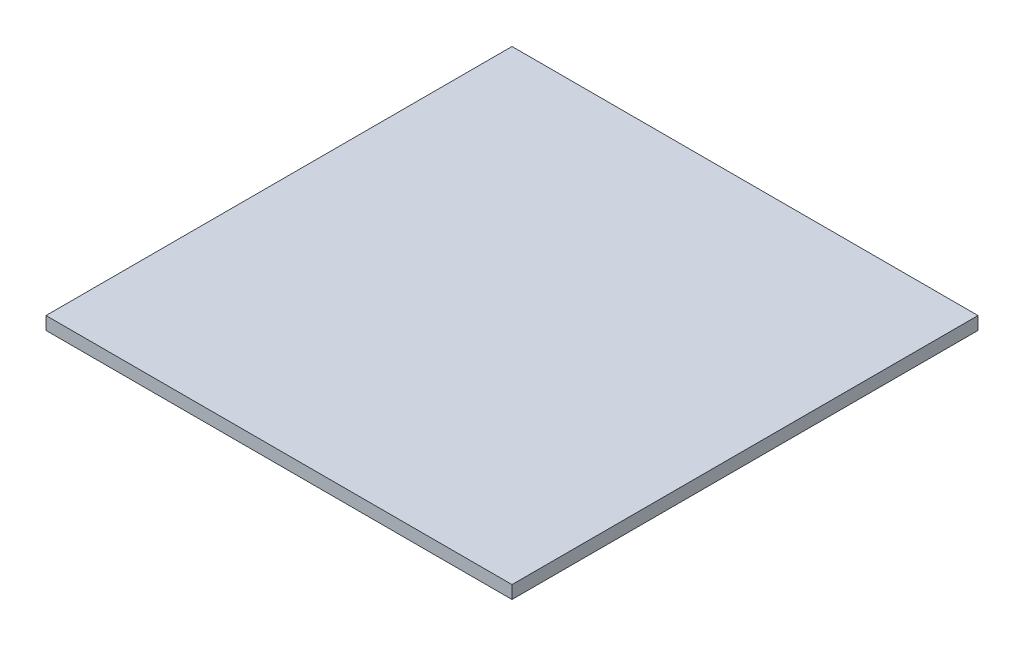
ISO-10303-21;
HEADER;
FILE_DESCRIPTION(('STEP AP214'),'2;1');
FILE_NAME('part.step','',(''),(''),'','','');
FILE_SCHEMA(('AUTOMOTIVE_DESIGN { 1 0 10303 214 1 1 1 1 }'));
ENDSEC;
DATA;
#1=APPLICATION_CONTEXT('core data for automotive mechanical design processes');
#2=APPLICATION_PROTOCOL_DEFINITION('international standard','automotive_design',2000,#1);
#3=PRODUCT_CONTEXT('',#1,'mechanical');
#4=PRODUCT('Part','Part','',(#3));
#5=PRODUCT_RELATED_PRODUCT_CATEGORY('part','',(#4));
#6=PRODUCT_DEFINITION_FORMATION('','',#4);
#7=PRODUCT_DEFINITION_CONTEXT('part definition',#1,'design');
#8=PRODUCT_DEFINITION('design','',#6,#7);
#9=PRODUCT_DEFINITION_SHAPE('','',#8);
#10=(LENGTH_UNIT() NAMED_UNIT(*) SI_UNIT(.MILLI.,.METRE.));
#11=(NAMED_UNIT(*) PLANE_ANGLE_UNIT() SI_UNIT($,.RADIAN.));
#12=(NAMED_UNIT(*) SI_UNIT($,.STERADIAN.) SOLID_ANGLE_UNIT());
#13=UNCERTAINTY_MEASURE_WITH_UNIT(LENGTH_MEASURE(1.E-05),#10,'distance_accuracy_value','');
#14=(GEOMETRIC_REPRESENTATION_CONTEXT(3) GLOBAL_UNCERTAINTY_ASSIGNED_CONTEXT((#13)) GLOBAL_UNIT_ASSIGNED_CONTEXT((#10,
#11,#12)) REPRESENTATION_CONTEXT('',''));
#15=CARTESIAN_POINT('',(0.,0.,0.));
#16=DIRECTION('',(0.,0.,1.));
#17=DIRECTION('',(1.,0.,0.));
#18=AXIS2_PLACEMENT_3D('',#15,#16,#17);
#19=CARTESIAN_POINT('',(-457.200000000001,-12.7000000000001,457.2));
#20=DIRECTION('',(1.,0.,0.));
#21=DIRECTION('',(0.,0.,-1.));
#22=AXIS2_PLACEMENT_3D('',#19,#20,#21);
#23=PLANE('',#22);
#24=DIRECTION('',(0.,-1.,0.));
#25=VECTOR('',#24,1.);
#26=CARTESIAN_POINT('',(-457.200000000001,-12.7000000000001,-457.2));
#27=LINE('',#26,#25);
#28=CARTESIAN_POINT('',(-457.200000000001,12.6999999999999,-457.2));
#29=VERTEX_POINT('',#28);
#30=CARTESIAN_POINT('',(-457.200000000001,-12.7000000000001,-457.2));
#31=VERTEX_POINT('',#30);
#32=EDGE_CURVE('E107',#29,#31,#27,.T.);
#33=ORIENTED_EDGE('',*,*,#32,.T.);
#34=DIRECTION('',(0.,0.,-1.));
#35=VECTOR('',#34,1.);
#36=CARTESIAN_POINT('',(-457.200000000001,-12.7000000000001,457.2));
#37=LINE('',#36,#35);
#38=CARTESIAN_POINT('',(-457.200000000001,-12.7000000000001,457.2));
#39=VERTEX_POINT('',#38);
#40=EDGE_CURVE('E11',#39,#31,#37,.T.);
#41=ORIENTED_EDGE('',*,*,#40,.F.);
#42=DIRECTION('',(0.,-1.,0.));
#43=VECTOR('',#42,1.);
#44=CARTESIAN_POINT('',(-457.200000000001,-12.7000000000001,457.2));
#45=LINE('',#44,#43);
#46=CARTESIAN_POINT('',(-457.200000000001,12.6999999999999,457.2));
#47=VERTEX_POINT('',#46);
#48=EDGE_CURVE('E91',#47,#39,#45,.T.);
#49=ORIENTED_EDGE('',*,*,#48,.F.);
#50=DIRECTION('',(0.,0.,-1.));
#51=VECTOR('',#50,1.);
#52=CARTESIAN_POINT('',(-457.200000000001,12.6999999999999,457.2));
#53=LINE('',#52,#51);
#54=EDGE_CURVE('E103',#47,#29,#53,.T.);
#55=ORIENTED_EDGE('',*,*,#54,.T.);
#56=EDGE_LOOP('',(#33,#41,#49,#55));
#57=FACE_BOUND('',#56,.T.);
#58=ADVANCED_FACE('F39',(#57),#23,.F.);
#59=CARTESIAN_POINT('',(457.199999999999,-12.6999999999999,457.2));
#60=DIRECTION('',(0.,1.,0.));
#61=DIRECTION('',(-1.,0.,0.));
#62=AXIS2_PLACEMENT_3D('',#59,#60,#61);
#63=PLANE('',#62);
#64=DIRECTION('',(1.,0.,0.));
#65=VECTOR('',#64,1.);
#66=CARTESIAN_POINT('',(457.199999999999,-12.6999999999999,-457.2));
#67=LINE('',#66,#65);
#68=CARTESIAN_POINT('',(457.199999999999,-12.6999999999999,-457.2));
#69=VERTEX_POINT('',#68);
#70=EDGE_CURVE('E96',#31,#69,#67,.T.);
#71=ORIENTED_EDGE('',*,*,#70,.T.);
#72=DIRECTION('',(0.,0.,-1.));
#73=VECTOR('',#72,1.);
#74=CARTESIAN_POINT('',(457.199999999999,-12.6999999999999,457.2));
#75=LINE('',#74,#73);
#76=CARTESIAN_POINT('',(457.199999999999,-12.6999999999999,457.2));
#77=VERTEX_POINT('',#76);
#78=EDGE_CURVE('E48',#77,#69,#75,.T.);
#79=ORIENTED_EDGE('',*,*,#78,.F.);
#80=DIRECTION('',(1.,0.,0.));
#81=VECTOR('',#80,1.);
#82=CARTESIAN_POINT('',(457.199999999999,-12.6999999999999,457.2));
#83=LINE('',#82,#81);
#84=EDGE_CURVE('E86',#39,#77,#83,.T.);
#85=ORIENTED_EDGE('',*,*,#84,.F.);
#86=ORIENTED_EDGE('',*,*,#40,.T.);
#87=EDGE_LOOP('',(#71,#79,#85,#86));
#88=FACE_BOUND('',#87,.T.);
#89=ADVANCED_FACE('F95',(#88),#63,.F.);
#90=CARTESIAN_POINT('',(457.199999999999,-12.6999999999999,457.2));
#91=DIRECTION('',(-1.,0.,0.));
#92=DIRECTION('',(0.,0.,1.));
#93=AXIS2_PLACEMENT_3D('',#90,#91,#92);
#94=PLANE('',#93);
#95=DIRECTION('',(0.,1.,0.));
#96=VECTOR('',#95,1.);
#97=CARTESIAN_POINT('',(457.199999999999,-12.6999999999999,-457.2));
#98=LINE('',#97,#96);
#99=CARTESIAN_POINT('',(457.199999999999,12.7,-457.2));
#100=VERTEX_POINT('',#99);
#101=EDGE_CURVE('E73',#69,#100,#98,.T.);
#102=ORIENTED_EDGE('',*,*,#101,.T.);
#103=DIRECTION('',(0.,0.,-1.));
#104=VECTOR('',#103,1.);
#105=CARTESIAN_POINT('',(457.199999999999,12.7,457.2));
#106=LINE('',#105,#104);
#107=CARTESIAN_POINT('',(457.199999999999,12.7,457.2));
#108=VERTEX_POINT('',#107);
#109=EDGE_CURVE('E98',#108,#100,#106,.T.);
#110=ORIENTED_EDGE('',*,*,#109,.F.);
#111=DIRECTION('',(0.,1.,0.));
#112=VECTOR('',#111,1.);
#113=CARTESIAN_POINT('',(457.199999999999,-12.6999999999999,457.2));
#114=LINE('',#113,#112);
#115=EDGE_CURVE('E89',#77,#108,#114,.T.);
#116=ORIENTED_EDGE('',*,*,#115,.F.);
#117=ORIENTED_EDGE('',*,*,#78,.T.);
#118=EDGE_LOOP('',(#102,#110,#116,#117));
#119=FACE_BOUND('',#118,.T.);
#120=ADVANCED_FACE('F99',(#119),#94,.F.);
#121=CARTESIAN_POINT('',(457.199999999999,12.7,457.2));
#122=DIRECTION('',(0.,-1.,0.));
#123=DIRECTION('',(1.,0.,0.));
#124=AXIS2_PLACEMENT_3D('',#121,#122,#123);
#125=PLANE('',#124);
#126=DIRECTION('',(-1.,0.,0.));
#127=VECTOR('',#126,1.);
#128=CARTESIAN_POINT('',(457.199999999999,12.7,-457.2));
#129=LINE('',#128,#127);
#130=EDGE_CURVE('E79',#100,#29,#129,.T.);
#131=ORIENTED_EDGE('',*,*,#130,.T.);
#132=ORIENTED_EDGE('',*,*,#54,.F.);
#133=DIRECTION('',(-1.,0.,0.));
#134=VECTOR('',#133,1.);
#135=CARTESIAN_POINT('',(457.199999999999,12.7,457.2));
#136=LINE('',#135,#134);
#137=EDGE_CURVE('E56',#108,#47,#136,.T.);
#138=ORIENTED_EDGE('',*,*,#137,.F.);
#139=ORIENTED_EDGE('',*,*,#109,.T.);
#140=EDGE_LOOP('',(#131,#132,#138,#139));
#141=FACE_BOUND('',#140,.T.);
#142=ADVANCED_FACE('F120',(#141),#125,.F.);
#143=CARTESIAN_POINT('',(0.,0.,457.2));
#144=DIRECTION('',(0.,0.,1.));
#145=DIRECTION('',(1.,0.,0.));
#146=AXIS2_PLACEMENT_3D('',#143,#144,#145);
#147=PLANE('',#146);
#148=ORIENTED_EDGE('',*,*,#48,.T.);
#149=ORIENTED_EDGE('',*,*,#84,.T.);
#150=ORIENTED_EDGE('',*,*,#115,.T.);
#151=ORIENTED_EDGE('',*,*,#137,.T.);
#152=EDGE_LOOP('',(#148,#149,#150,#151));
#153=FACE_BOUND('',#152,.T.);
#154=ADVANCED_FACE('F87',(#153),#147,.T.);
#155=CARTESIAN_POINT('',(0.,0.,-457.2));
#156=DIRECTION('',(0.,0.,1.));
#157=DIRECTION('',(1.,0.,0.));
#158=AXIS2_PLACEMENT_3D('',#155,#156,#157);
#159=PLANE('',#158);
#160=ORIENTED_EDGE('',*,*,#32,.F.);
#161=ORIENTED_EDGE('',*,*,#130,.F.);
#162=ORIENTED_EDGE('',*,*,#101,.F.);
#163=ORIENTED_EDGE('',*,*,#70,.F.);
#164=EDGE_LOOP('',(#160,#161,#162,#163));
#165=FACE_BOUND('',#164,.T.);
#166=ADVANCED_FACE('F123',(#165),#159,.F.);
#167=CLOSED_SHELL('',(#58,#89,#120,#142,#154,#166));
#168=MANIFOLD_SOLID_BREP('B2',#167);
#169=ADVANCED_BREP_SHAPE_REPRESENTATION('',(#18,#168),#14);
#170=SHAPE_DEFINITION_REPRESENTATION(#9,#169);
ENDSEC;
END-ISO-10303-21;
